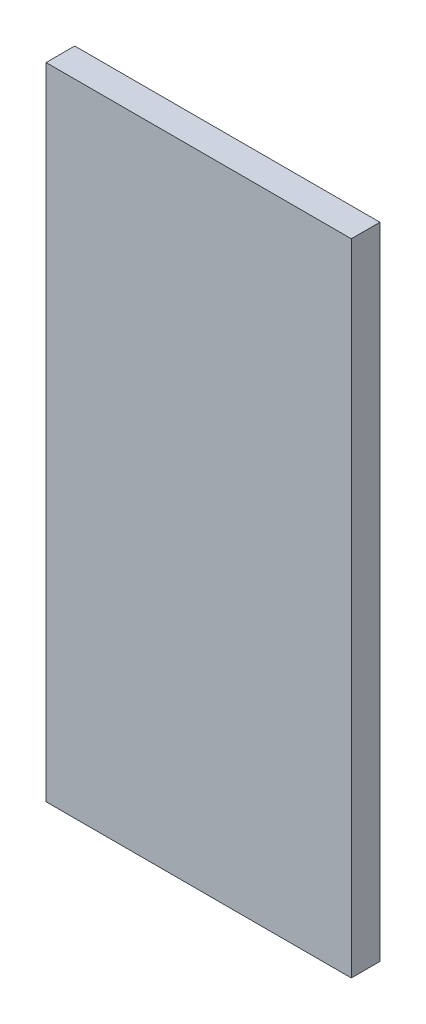
ISO-10303-21;
HEADER;
FILE_DESCRIPTION(('STEP AP214'),'2;1');
FILE_NAME('part.step','',(''),(''),'','','');
FILE_SCHEMA(('AUTOMOTIVE_DESIGN { 1 0 10303 214 1 1 1 1 }'));
ENDSEC;
DATA;
#1=APPLICATION_CONTEXT('core data for automotive mechanical design processes');
#2=APPLICATION_PROTOCOL_DEFINITION('international standard','automotive_design',2000,#1);
#3=PRODUCT_CONTEXT('',#1,'mechanical');
#4=PRODUCT('Part','Part','',(#3));
#5=PRODUCT_RELATED_PRODUCT_CATEGORY('part','',(#4));
#6=PRODUCT_DEFINITION_FORMATION('','',#4);
#7=PRODUCT_DEFINITION_CONTEXT('part definition',#1,'design');
#8=PRODUCT_DEFINITION('design','',#6,#7);
#9=PRODUCT_DEFINITION_SHAPE('','',#8);
#10=(LENGTH_UNIT() NAMED_UNIT(*) SI_UNIT(.MILLI.,.METRE.));
#11=(NAMED_UNIT(*) PLANE_ANGLE_UNIT() SI_UNIT($,.RADIAN.));
#12=(NAMED_UNIT(*) SI_UNIT($,.STERADIAN.) SOLID_ANGLE_UNIT());
#13=UNCERTAINTY_MEASURE_WITH_UNIT(LENGTH_MEASURE(1.E-05),#10,'distance_accuracy_value','');
#14=(GEOMETRIC_REPRESENTATION_CONTEXT(3) GLOBAL_UNCERTAINTY_ASSIGNED_CONTEXT((#13)) GLOBAL_UNIT_ASSIGNED_CONTEXT((#10,
#11,#12)) REPRESENTATION_CONTEXT('',''));
#15=CARTESIAN_POINT('',(0.,0.,0.));
#16=DIRECTION('',(0.,0.,1.));
#17=DIRECTION('',(1.,0.,0.));
#18=AXIS2_PLACEMENT_3D('',#15,#16,#17);
#19=CARTESIAN_POINT('',(-47.4267685592235,-326.203379342507,19.05));
#20=DIRECTION('',(0.,1.,0.));
#21=DIRECTION('',(0.,0.,1.));
#22=AXIS2_PLACEMENT_3D('',#19,#20,#21);
#23=PLANE('',#22);
#24=DIRECTION('',(1.,0.,0.));
#25=VECTOR('',#24,1.);
#26=CARTESIAN_POINT('',(-47.4267685592235,-326.203379342507,0.));
#27=LINE('',#26,#25);
#28=CARTESIAN_POINT('',(-47.4267685592235,-326.203379342507,0.));
#29=VERTEX_POINT('',#28);
#30=CARTESIAN_POINT('',(155.773231440776,-326.203379342507,0.));
#31=VERTEX_POINT('',#30);
#32=EDGE_CURVE('E106',#29,#31,#27,.T.);
#33=ORIENTED_EDGE('',*,*,#32,.T.);
#34=DIRECTION('',(0.,0.,-1.));
#35=VECTOR('',#34,1.);
#36=CARTESIAN_POINT('',(155.773231440776,-326.203379342507,19.05));
#37=LINE('',#36,#35);
#38=CARTESIAN_POINT('',(155.773231440776,-326.203379342507,19.05));
#39=VERTEX_POINT('',#38);
#40=EDGE_CURVE('E11',#39,#31,#37,.T.);
#41=ORIENTED_EDGE('',*,*,#40,.F.);
#42=DIRECTION('',(1.,0.,0.));
#43=VECTOR('',#42,1.);
#44=CARTESIAN_POINT('',(-47.4267685592235,-326.203379342507,19.05));
#45=LINE('',#44,#43);
#46=CARTESIAN_POINT('',(-47.4267685592235,-326.203379342507,19.05));
#47=VERTEX_POINT('',#46);
#48=EDGE_CURVE('E79',#47,#39,#45,.T.);
#49=ORIENTED_EDGE('',*,*,#48,.F.);
#50=DIRECTION('',(0.,0.,-1.));
#51=VECTOR('',#50,1.);
#52=CARTESIAN_POINT('',(-47.4267685592235,-326.203379342507,19.05));
#53=LINE('',#52,#51);
#54=EDGE_CURVE('E102',#47,#29,#53,.T.);
#55=ORIENTED_EDGE('',*,*,#54,.T.);
#56=EDGE_LOOP('',(#33,#41,#49,#55));
#57=FACE_BOUND('',#56,.T.);
#58=ADVANCED_FACE('F39',(#57),#23,.F.);
#59=CARTESIAN_POINT('',(155.773231440776,100.008620657493,19.05));
#60=DIRECTION('',(1.,0.,0.));
#61=DIRECTION('',(0.,1.,0.));
#62=AXIS2_PLACEMENT_3D('',#59,#60,#61);
#63=PLANE('',#62);
#64=DIRECTION('',(0.,-1.,0.));
#65=VECTOR('',#64,1.);
#66=CARTESIAN_POINT('',(155.773231440776,100.008620657493,0.));
#67=LINE('',#66,#65);
#68=CARTESIAN_POINT('',(155.773231440776,100.008620657493,0.));
#69=VERTEX_POINT('',#68);
#70=EDGE_CURVE('E88',#69,#31,#67,.T.);
#71=ORIENTED_EDGE('',*,*,#70,.F.);
#72=DIRECTION('',(0.,0.,-1.));
#73=VECTOR('',#72,1.);
#74=CARTESIAN_POINT('',(155.773231440776,100.008620657493,19.05));
#75=LINE('',#74,#73);
#76=CARTESIAN_POINT('',(155.773231440776,100.008620657493,19.05));
#77=VERTEX_POINT('',#76);
#78=EDGE_CURVE('E48',#77,#69,#75,.T.);
#79=ORIENTED_EDGE('',*,*,#78,.F.);
#80=DIRECTION('',(0.,-1.,0.));
#81=VECTOR('',#80,1.);
#82=CARTESIAN_POINT('',(155.773231440776,100.008620657493,19.05));
#83=LINE('',#82,#81);
#84=EDGE_CURVE('E86',#77,#39,#83,.T.);
#85=ORIENTED_EDGE('',*,*,#84,.T.);
#86=ORIENTED_EDGE('',*,*,#40,.T.);
#87=EDGE_LOOP('',(#71,#79,#85,#86));
#88=FACE_BOUND('',#87,.T.);
#89=ADVANCED_FACE('F85',(#88),#63,.T.);
#90=CARTESIAN_POINT('',(-47.4267685592236,100.008620657493,19.05));
#91=DIRECTION('',(0.,1.,0.));
#92=DIRECTION('',(0.,0.,1.));
#93=AXIS2_PLACEMENT_3D('',#90,#91,#92);
#94=PLANE('',#93);
#95=DIRECTION('',(1.,0.,0.));
#96=VECTOR('',#95,1.);
#97=CARTESIAN_POINT('',(-47.4267685592236,100.008620657493,0.));
#98=LINE('',#97,#96);
#99=CARTESIAN_POINT('',(-47.4267685592236,100.008620657493,0.));
#100=VERTEX_POINT('',#99);
#101=EDGE_CURVE('E112',#100,#69,#98,.T.);
#102=ORIENTED_EDGE('',*,*,#101,.F.);
#103=DIRECTION('',(0.,0.,-1.));
#104=VECTOR('',#103,1.);
#105=CARTESIAN_POINT('',(-47.4267685592236,100.008620657493,19.05));
#106=LINE('',#105,#104);
#107=CARTESIAN_POINT('',(-47.4267685592236,100.008620657493,19.05));
#108=VERTEX_POINT('',#107);
#109=EDGE_CURVE('E71',#108,#100,#106,.T.);
#110=ORIENTED_EDGE('',*,*,#109,.F.);
#111=DIRECTION('',(1.,0.,0.));
#112=VECTOR('',#111,1.);
#113=CARTESIAN_POINT('',(-47.4267685592236,100.008620657493,19.05));
#114=LINE('',#113,#112);
#115=EDGE_CURVE('E95',#108,#77,#114,.T.);
#116=ORIENTED_EDGE('',*,*,#115,.T.);
#117=ORIENTED_EDGE('',*,*,#78,.T.);
#118=EDGE_LOOP('',(#102,#110,#116,#117));
#119=FACE_BOUND('',#118,.T.);
#120=ADVANCED_FACE('F98',(#119),#94,.T.);
#121=CARTESIAN_POINT('',(-47.4267685592236,100.008620657493,19.05));
#122=DIRECTION('',(1.,0.,0.));
#123=DIRECTION('',(0.,1.,0.));
#124=AXIS2_PLACEMENT_3D('',#121,#122,#123);
#125=PLANE('',#124);
#126=DIRECTION('',(0.,-1.,0.));
#127=VECTOR('',#126,1.);
#128=CARTESIAN_POINT('',(-47.4267685592236,100.008620657493,0.));
#129=LINE('',#128,#127);
#130=EDGE_CURVE('E74',#100,#29,#129,.T.);
#131=ORIENTED_EDGE('',*,*,#130,.T.);
#132=ORIENTED_EDGE('',*,*,#54,.F.);
#133=DIRECTION('',(0.,-1.,0.));
#134=VECTOR('',#133,1.);
#135=CARTESIAN_POINT('',(-47.4267685592236,100.008620657493,19.05));
#136=LINE('',#135,#134);
#137=EDGE_CURVE('E56',#108,#47,#136,.T.);
#138=ORIENTED_EDGE('',*,*,#137,.F.);
#139=ORIENTED_EDGE('',*,*,#109,.T.);
#140=EDGE_LOOP('',(#131,#132,#138,#139));
#141=FACE_BOUND('',#140,.T.);
#142=ADVANCED_FACE('F129',(#141),#125,.F.);
#143=CARTESIAN_POINT('',(0.,0.,19.05));
#144=DIRECTION('',(0.,0.,-1.));
#145=DIRECTION('',(-1.,0.,0.));
#146=AXIS2_PLACEMENT_3D('',#143,#144,#145);
#147=PLANE('',#146);
#148=ORIENTED_EDGE('',*,*,#48,.T.);
#149=ORIENTED_EDGE('',*,*,#84,.F.);
#150=ORIENTED_EDGE('',*,*,#115,.F.);
#151=ORIENTED_EDGE('',*,*,#137,.T.);
#152=EDGE_LOOP('',(#148,#149,#150,#151));
#153=FACE_BOUND('',#152,.T.);
#154=ADVANCED_FACE('F94',(#153),#147,.F.);
#155=CARTESIAN_POINT('',(0.,0.,0.));
#156=DIRECTION('',(0.,0.,-1.));
#157=DIRECTION('',(-1.,0.,0.));
#158=AXIS2_PLACEMENT_3D('',#155,#156,#157);
#159=PLANE('',#158);
#160=ORIENTED_EDGE('',*,*,#32,.F.);
#161=ORIENTED_EDGE('',*,*,#130,.F.);
#162=ORIENTED_EDGE('',*,*,#101,.T.);
#163=ORIENTED_EDGE('',*,*,#70,.T.);
#164=EDGE_LOOP('',(#160,#161,#162,#163));
#165=FACE_BOUND('',#164,.T.);
#166=ADVANCED_FACE('F123',(#165),#159,.T.);
#167=CLOSED_SHELL('',(#58,#89,#120,#142,#154,#166));
#168=MANIFOLD_SOLID_BREP('B2',#167);
#169=ADVANCED_BREP_SHAPE_REPRESENTATION('',(#18,#168),#14);
#170=SHAPE_DEFINITION_REPRESENTATION(#9,#169);
ENDSEC;
END-ISO-10303-21;
